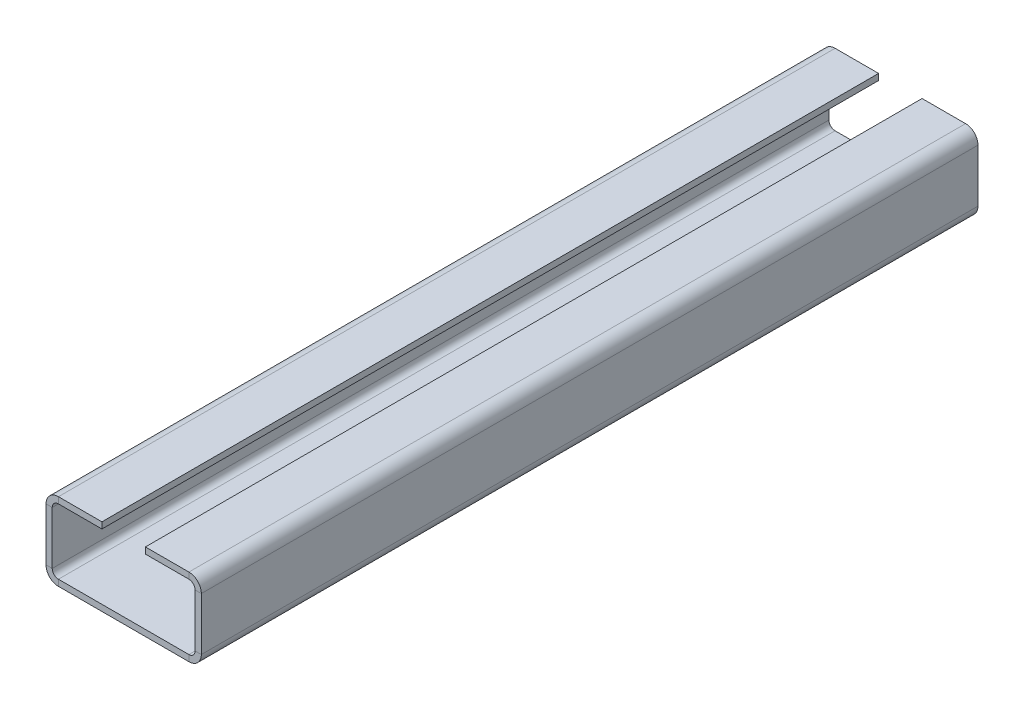
ISO-10303-21;
HEADER;
FILE_DESCRIPTION(('STEP AP214'),'2;1');
FILE_NAME('part.step','',(''),(''),'','','');
FILE_SCHEMA(('AUTOMOTIVE_DESIGN { 1 0 10303 214 1 1 1 1 }'));
ENDSEC;
DATA;
#1=APPLICATION_CONTEXT('core data for automotive mechanical design processes');
#2=APPLICATION_PROTOCOL_DEFINITION('international standard','automotive_design',2000,#1);
#3=PRODUCT_CONTEXT('',#1,'mechanical');
#4=PRODUCT('Part','Part','',(#3));
#5=PRODUCT_RELATED_PRODUCT_CATEGORY('part','',(#4));
#6=PRODUCT_DEFINITION_FORMATION('','',#4);
#7=PRODUCT_DEFINITION_CONTEXT('part definition',#1,'design');
#8=PRODUCT_DEFINITION('design','',#6,#7);
#9=PRODUCT_DEFINITION_SHAPE('','',#8);
#10=(LENGTH_UNIT() NAMED_UNIT(*) SI_UNIT(.MILLI.,.METRE.));
#11=(NAMED_UNIT(*) PLANE_ANGLE_UNIT() SI_UNIT($,.RADIAN.));
#12=(NAMED_UNIT(*) SI_UNIT($,.STERADIAN.) SOLID_ANGLE_UNIT());
#13=UNCERTAINTY_MEASURE_WITH_UNIT(LENGTH_MEASURE(1.E-05),#10,'distance_accuracy_value','');
#14=(GEOMETRIC_REPRESENTATION_CONTEXT(3) GLOBAL_UNCERTAINTY_ASSIGNED_CONTEXT((#13)) GLOBAL_UNIT_ASSIGNED_CONTEXT((#10,
#11,#12)) REPRESENTATION_CONTEXT('',''));
#15=CARTESIAN_POINT('',(0.,0.,0.));
#16=DIRECTION('',(0.,0.,1.));
#17=DIRECTION('',(1.,0.,0.));
#18=AXIS2_PLACEMENT_3D('',#15,#16,#17);
#19=CARTESIAN_POINT('',(4.,25.,250.));
#20=DIRECTION('',(0.,0.,1.));
#21=DIRECTION('',(1.,0.,0.));
#22=AXIS2_PLACEMENT_3D('',#19,#20,#21);
#23=PLANE('',#22);
#24=DIRECTION('',(0.,-1.,0.));
#25=VECTOR('',#24,1.);
#26=CARTESIAN_POINT('',(4.,25.,250.));
#27=LINE('',#26,#25);
#28=CARTESIAN_POINT('',(4.,25.,250.));
#29=VERTEX_POINT('',#28);
#30=CARTESIAN_POINT('',(4.,23.,250.));
#31=VERTEX_POINT('',#30);
#32=EDGE_CURVE('E11',#29,#31,#27,.T.);
#33=ORIENTED_EDGE('',*,*,#32,.F.);
#34=CARTESIAN_POINT('',(4.,21.,250.));
#35=DIRECTION('',(0.,0.,-1.));
#36=DIRECTION('',(-1.,0.,0.));
#37=AXIS2_PLACEMENT_3D('',#34,#35,#36);
#38=CIRCLE('',#37,4.);
#39=CARTESIAN_POINT('',(0.,21.,250.));
#40=VERTEX_POINT('',#39);
#41=EDGE_CURVE('E361',#29,#40,#38,.F.);
#42=ORIENTED_EDGE('',*,*,#41,.T.);
#43=DIRECTION('',(-1.,0.,0.));
#44=VECTOR('',#43,1.);
#45=CARTESIAN_POINT('',(2.,21.,250.));
#46=LINE('',#45,#44);
#47=CARTESIAN_POINT('',(2.,21.,250.));
#48=VERTEX_POINT('',#47);
#49=EDGE_CURVE('E44',#48,#40,#46,.T.);
#50=ORIENTED_EDGE('',*,*,#49,.F.);
#51=CARTESIAN_POINT('',(4.,21.,250.));
#52=DIRECTION('',(0.,0.,1.));
#53=DIRECTION('',(1.,0.,0.));
#54=AXIS2_PLACEMENT_3D('',#51,#52,#53);
#55=CIRCLE('',#54,2.);
#56=EDGE_CURVE('E436',#31,#48,#55,.T.);
#57=ORIENTED_EDGE('',*,*,#56,.F.);
#58=EDGE_LOOP('',(#33,#42,#50,#57));
#59=FACE_BOUND('',#58,.T.);
#60=ADVANCED_FACE('F36',(#59),#23,.T.);
#61=CARTESIAN_POINT('',(2.,21.,250.));
#62=DIRECTION('',(0.,0.,1.));
#63=DIRECTION('',(1.,0.,0.));
#64=AXIS2_PLACEMENT_3D('',#61,#62,#63);
#65=PLANE('',#64);
#66=DIRECTION('',(-1.,0.,0.));
#67=VECTOR('',#66,1.);
#68=CARTESIAN_POINT('',(18.,25.,250.));
#69=LINE('',#68,#67);
#70=CARTESIAN_POINT('',(18.,25.,250.));
#71=VERTEX_POINT('',#70);
#72=EDGE_CURVE('E365',#71,#29,#69,.T.);
#73=ORIENTED_EDGE('',*,*,#72,.T.);
#74=ORIENTED_EDGE('',*,*,#32,.T.);
#75=DIRECTION('',(1.,0.,0.));
#76=VECTOR('',#75,1.);
#77=CARTESIAN_POINT('',(18.,23.,250.));
#78=LINE('',#77,#76);
#79=CARTESIAN_POINT('',(18.,23.,250.));
#80=VERTEX_POINT('',#79);
#81=EDGE_CURVE('E438',#80,#31,#78,.F.);
#82=ORIENTED_EDGE('',*,*,#81,.F.);
#83=DIRECTION('',(0.,-1.,0.));
#84=VECTOR('',#83,1.);
#85=CARTESIAN_POINT('',(18.,25.,250.));
#86=LINE('',#85,#84);
#87=EDGE_CURVE('E441',#71,#80,#86,.T.);
#88=ORIENTED_EDGE('',*,*,#87,.F.);
#89=EDGE_LOOP('',(#73,#74,#82,#88));
#90=FACE_BOUND('',#89,.T.);
#91=ADVANCED_FACE('F447',(#90),#65,.T.);
#92=CARTESIAN_POINT('',(0.,21.,0.));
#93=DIRECTION('',(0.,0.,-1.));
#94=DIRECTION('',(-1.,0.,0.));
#95=AXIS2_PLACEMENT_3D('',#92,#93,#94);
#96=PLANE('',#95);
#97=DIRECTION('',(1.,0.,0.));
#98=VECTOR('',#97,1.);
#99=CARTESIAN_POINT('',(0.,21.,0.));
#100=LINE('',#99,#98);
#101=CARTESIAN_POINT('',(0.,21.,0.));
#102=VERTEX_POINT('',#101);
#103=CARTESIAN_POINT('',(2.,21.,0.));
#104=VERTEX_POINT('',#103);
#105=EDGE_CURVE('E345',#102,#104,#100,.T.);
#106=ORIENTED_EDGE('',*,*,#105,.F.);
#107=CARTESIAN_POINT('',(4.,21.,0.));
#108=DIRECTION('',(0.,0.,-1.));
#109=DIRECTION('',(-1.,0.,0.));
#110=AXIS2_PLACEMENT_3D('',#107,#108,#109);
#111=CIRCLE('',#110,4.);
#112=CARTESIAN_POINT('',(4.,25.,0.));
#113=VERTEX_POINT('',#112);
#114=EDGE_CURVE('E261',#113,#102,#111,.F.);
#115=ORIENTED_EDGE('',*,*,#114,.F.);
#116=DIRECTION('',(0.,1.,0.));
#117=VECTOR('',#116,1.);
#118=CARTESIAN_POINT('',(4.,23.,0.));
#119=LINE('',#118,#117);
#120=CARTESIAN_POINT('',(4.,23.,0.));
#121=VERTEX_POINT('',#120);
#122=EDGE_CURVE('E343',#121,#113,#119,.T.);
#123=ORIENTED_EDGE('',*,*,#122,.F.);
#124=CARTESIAN_POINT('',(4.,21.,0.));
#125=DIRECTION('',(0.,0.,1.));
#126=DIRECTION('',(1.,0.,0.));
#127=AXIS2_PLACEMENT_3D('',#124,#125,#126);
#128=CIRCLE('',#127,2.);
#129=EDGE_CURVE('E249',#121,#104,#128,.T.);
#130=ORIENTED_EDGE('',*,*,#129,.T.);
#131=EDGE_LOOP('',(#106,#115,#123,#130));
#132=FACE_BOUND('',#131,.T.);
#133=ADVANCED_FACE('F454',(#132),#96,.T.);
#134=CARTESIAN_POINT('',(4.,23.,0.));
#135=DIRECTION('',(0.,0.,-1.));
#136=DIRECTION('',(-1.,0.,0.));
#137=AXIS2_PLACEMENT_3D('',#134,#135,#136);
#138=PLANE('',#137);
#139=DIRECTION('',(0.,-1.,0.));
#140=VECTOR('',#139,1.);
#141=CARTESIAN_POINT('',(0.,25.,0.));
#142=LINE('',#141,#140);
#143=CARTESIAN_POINT('',(0.,4.,0.));
#144=VERTEX_POINT('',#143);
#145=EDGE_CURVE('E264',#102,#144,#142,.T.);
#146=ORIENTED_EDGE('',*,*,#145,.F.);
#147=ORIENTED_EDGE('',*,*,#105,.T.);
#148=DIRECTION('',(0.,-1.,0.));
#149=VECTOR('',#148,1.);
#150=CARTESIAN_POINT('',(2.,25.,0.));
#151=LINE('',#150,#149);
#152=CARTESIAN_POINT('',(2.,4.,0.));
#153=VERTEX_POINT('',#152);
#154=EDGE_CURVE('E246',#104,#153,#151,.T.);
#155=ORIENTED_EDGE('',*,*,#154,.T.);
#156=DIRECTION('',(-1.,0.,0.));
#157=VECTOR('',#156,1.);
#158=CARTESIAN_POINT('',(2.,4.,0.));
#159=LINE('',#158,#157);
#160=EDGE_CURVE('E335',#153,#144,#159,.T.);
#161=ORIENTED_EDGE('',*,*,#160,.T.);
#162=EDGE_LOOP('',(#146,#147,#155,#161));
#163=FACE_BOUND('',#162,.T.);
#164=ADVANCED_FACE('F457',(#163),#138,.T.);
#165=CARTESIAN_POINT('',(0.,4.,250.));
#166=DIRECTION('',(0.,0.,1.));
#167=DIRECTION('',(1.,0.,0.));
#168=AXIS2_PLACEMENT_3D('',#165,#166,#167);
#169=PLANE('',#168);
#170=DIRECTION('',(1.,0.,0.));
#171=VECTOR('',#170,1.);
#172=CARTESIAN_POINT('',(0.,4.,250.));
#173=LINE('',#172,#171);
#174=CARTESIAN_POINT('',(0.,4.,250.));
#175=VERTEX_POINT('',#174);
#176=CARTESIAN_POINT('',(2.,4.,250.));
#177=VERTEX_POINT('',#176);
#178=EDGE_CURVE('E341',#175,#177,#173,.T.);
#179=ORIENTED_EDGE('',*,*,#178,.F.);
#180=CARTESIAN_POINT('',(4.,4.,250.));
#181=DIRECTION('',(0.,0.,-1.));
#182=DIRECTION('',(-1.,0.,0.));
#183=AXIS2_PLACEMENT_3D('',#180,#181,#182);
#184=CIRCLE('',#183,4.);
#185=CARTESIAN_POINT('',(4.,0.,250.));
#186=VERTEX_POINT('',#185);
#187=EDGE_CURVE('E373',#175,#186,#184,.F.);
#188=ORIENTED_EDGE('',*,*,#187,.T.);
#189=DIRECTION('',(0.,-1.,0.));
#190=VECTOR('',#189,1.);
#191=CARTESIAN_POINT('',(4.,2.,250.));
#192=LINE('',#191,#190);
#193=CARTESIAN_POINT('',(4.,2.,250.));
#194=VERTEX_POINT('',#193);
#195=EDGE_CURVE('E339',#194,#186,#192,.T.);
#196=ORIENTED_EDGE('',*,*,#195,.F.);
#197=CARTESIAN_POINT('',(4.,4.,250.));
#198=DIRECTION('',(0.,0.,1.));
#199=DIRECTION('',(1.,0.,0.));
#200=AXIS2_PLACEMENT_3D('',#197,#198,#199);
#201=CIRCLE('',#200,2.);
#202=EDGE_CURVE('E432',#177,#194,#201,.T.);
#203=ORIENTED_EDGE('',*,*,#202,.F.);
#204=EDGE_LOOP('',(#179,#188,#196,#203));
#205=FACE_BOUND('',#204,.T.);
#206=ADVANCED_FACE('F477',(#205),#169,.T.);
#207=CARTESIAN_POINT('',(4.,2.,250.));
#208=DIRECTION('',(0.,0.,1.));
#209=DIRECTION('',(1.,0.,0.));
#210=AXIS2_PLACEMENT_3D('',#207,#208,#209);
#211=PLANE('',#210);
#212=DIRECTION('',(0.,-1.,0.));
#213=VECTOR('',#212,1.);
#214=CARTESIAN_POINT('',(0.,25.,250.));
#215=LINE('',#214,#213);
#216=EDGE_CURVE('E352',#40,#175,#215,.T.);
#217=ORIENTED_EDGE('',*,*,#216,.T.);
#218=ORIENTED_EDGE('',*,*,#178,.T.);
#219=DIRECTION('',(0.,-1.,0.));
#220=VECTOR('',#219,1.);
#221=CARTESIAN_POINT('',(2.,25.,250.));
#222=LINE('',#221,#220);
#223=EDGE_CURVE('E355',#48,#177,#222,.T.);
#224=ORIENTED_EDGE('',*,*,#223,.F.);
#225=ORIENTED_EDGE('',*,*,#49,.T.);
#226=EDGE_LOOP('',(#217,#218,#224,#225));
#227=FACE_BOUND('',#226,.T.);
#228=ADVANCED_FACE('F350',(#227),#211,.T.);
#229=CARTESIAN_POINT('',(4.,0.,0.));
#230=DIRECTION('',(0.,0.,-1.));
#231=DIRECTION('',(-1.,0.,0.));
#232=AXIS2_PLACEMENT_3D('',#229,#230,#231);
#233=PLANE('',#232);
#234=DIRECTION('',(0.,1.,0.));
#235=VECTOR('',#234,1.);
#236=CARTESIAN_POINT('',(4.,0.,0.));
#237=LINE('',#236,#235);
#238=CARTESIAN_POINT('',(4.,0.,0.));
#239=VERTEX_POINT('',#238);
#240=CARTESIAN_POINT('',(4.,2.,0.));
#241=VERTEX_POINT('',#240);
#242=EDGE_CURVE('E337',#239,#241,#237,.T.);
#243=ORIENTED_EDGE('',*,*,#242,.F.);
#244=CARTESIAN_POINT('',(4.,4.,0.));
#245=DIRECTION('',(0.,0.,-1.));
#246=DIRECTION('',(-1.,0.,0.));
#247=AXIS2_PLACEMENT_3D('',#244,#245,#246);
#248=CIRCLE('',#247,4.);
#249=EDGE_CURVE('E267',#144,#239,#248,.F.);
#250=ORIENTED_EDGE('',*,*,#249,.F.);
#251=ORIENTED_EDGE('',*,*,#160,.F.);
#252=CARTESIAN_POINT('',(4.,4.,0.));
#253=DIRECTION('',(0.,0.,1.));
#254=DIRECTION('',(1.,0.,0.));
#255=AXIS2_PLACEMENT_3D('',#252,#253,#254);
#256=CIRCLE('',#255,2.);
#257=EDGE_CURVE('E243',#153,#241,#256,.T.);
#258=ORIENTED_EDGE('',*,*,#257,.T.);
#259=EDGE_LOOP('',(#243,#250,#251,#258));
#260=FACE_BOUND('',#259,.T.);
#261=ADVANCED_FACE('F471',(#260),#233,.T.);
#262=CARTESIAN_POINT('',(2.,4.,0.));
#263=DIRECTION('',(0.,0.,-1.));
#264=DIRECTION('',(-1.,0.,0.));
#265=AXIS2_PLACEMENT_3D('',#262,#263,#264);
#266=PLANE('',#265);
#267=DIRECTION('',(1.,0.,0.));
#268=VECTOR('',#267,1.);
#269=CARTESIAN_POINT('',(0.,0.,0.));
#270=LINE('',#269,#268);
#271=CARTESIAN_POINT('',(46.,0.,0.));
#272=VERTEX_POINT('',#271);
#273=EDGE_CURVE('E270',#239,#272,#270,.T.);
#274=ORIENTED_EDGE('',*,*,#273,.F.);
#275=ORIENTED_EDGE('',*,*,#242,.T.);
#276=DIRECTION('',(1.,0.,0.));
#277=VECTOR('',#276,1.);
#278=CARTESIAN_POINT('',(0.,2.,0.));
#279=LINE('',#278,#277);
#280=CARTESIAN_POINT('',(46.,2.,0.));
#281=VERTEX_POINT('',#280);
#282=EDGE_CURVE('E240',#241,#281,#279,.T.);
#283=ORIENTED_EDGE('',*,*,#282,.T.);
#284=DIRECTION('',(0.,-1.,0.));
#285=VECTOR('',#284,1.);
#286=CARTESIAN_POINT('',(46.,2.,0.));
#287=LINE('',#286,#285);
#288=EDGE_CURVE('E331',#281,#272,#287,.T.);
#289=ORIENTED_EDGE('',*,*,#288,.T.);
#290=EDGE_LOOP('',(#274,#275,#283,#289));
#291=FACE_BOUND('',#290,.T.);
#292=ADVANCED_FACE('F481',(#291),#266,.T.);
#293=CARTESIAN_POINT('',(46.,0.,250.));
#294=DIRECTION('',(0.,0.,1.));
#295=DIRECTION('',(1.,0.,0.));
#296=AXIS2_PLACEMENT_3D('',#293,#294,#295);
#297=PLANE('',#296);
#298=DIRECTION('',(0.,1.,0.));
#299=VECTOR('',#298,1.);
#300=CARTESIAN_POINT('',(46.,0.,250.));
#301=LINE('',#300,#299);
#302=CARTESIAN_POINT('',(46.,0.,250.));
#303=VERTEX_POINT('',#302);
#304=CARTESIAN_POINT('',(46.,2.,250.));
#305=VERTEX_POINT('',#304);
#306=EDGE_CURVE('E193',#303,#305,#301,.T.);
#307=ORIENTED_EDGE('',*,*,#306,.F.);
#308=CARTESIAN_POINT('',(46.,4.,250.));
#309=DIRECTION('',(0.,0.,-1.));
#310=DIRECTION('',(-1.,0.,0.));
#311=AXIS2_PLACEMENT_3D('',#308,#309,#310);
#312=CIRCLE('',#311,4.);
#313=CARTESIAN_POINT('',(50.,4.,250.));
#314=VERTEX_POINT('',#313);
#315=EDGE_CURVE('E197',#303,#314,#312,.F.);
#316=ORIENTED_EDGE('',*,*,#315,.T.);
#317=DIRECTION('',(1.,0.,0.));
#318=VECTOR('',#317,1.);
#319=CARTESIAN_POINT('',(48.,4.,250.));
#320=LINE('',#319,#318);
#321=CARTESIAN_POINT('',(48.,4.,250.));
#322=VERTEX_POINT('',#321);
#323=EDGE_CURVE('E181',#322,#314,#320,.T.);
#324=ORIENTED_EDGE('',*,*,#323,.F.);
#325=CARTESIAN_POINT('',(46.,4.,250.));
#326=DIRECTION('',(0.,0.,1.));
#327=DIRECTION('',(1.,0.,0.));
#328=AXIS2_PLACEMENT_3D('',#325,#326,#327);
#329=CIRCLE('',#328,2.);
#330=EDGE_CURVE('E394',#305,#322,#329,.T.);
#331=ORIENTED_EDGE('',*,*,#330,.F.);
#332=EDGE_LOOP('',(#307,#316,#324,#331));
#333=FACE_BOUND('',#332,.T.);
#334=ADVANCED_FACE('F199',(#333),#297,.T.);
#335=CARTESIAN_POINT('',(48.,4.,250.));
#336=DIRECTION('',(0.,0.,1.));
#337=DIRECTION('',(1.,0.,0.));
#338=AXIS2_PLACEMENT_3D('',#335,#336,#337);
#339=PLANE('',#338);
#340=DIRECTION('',(1.,0.,0.));
#341=VECTOR('',#340,1.);
#342=CARTESIAN_POINT('',(0.,0.,250.));
#343=LINE('',#342,#341);
#344=EDGE_CURVE('E203',#186,#303,#343,.T.);
#345=ORIENTED_EDGE('',*,*,#344,.T.);
#346=ORIENTED_EDGE('',*,*,#306,.T.);
#347=DIRECTION('',(1.,0.,0.));
#348=VECTOR('',#347,1.);
#349=CARTESIAN_POINT('',(0.,2.,250.));
#350=LINE('',#349,#348);
#351=EDGE_CURVE('E429',#194,#305,#350,.T.);
#352=ORIENTED_EDGE('',*,*,#351,.F.);
#353=ORIENTED_EDGE('',*,*,#195,.T.);
#354=EDGE_LOOP('',(#345,#346,#352,#353));
#355=FACE_BOUND('',#354,.T.);
#356=ADVANCED_FACE('F381',(#355),#339,.T.);
#357=CARTESIAN_POINT('',(50.,4.,0.));
#358=DIRECTION('',(0.,0.,-1.));
#359=DIRECTION('',(-1.,0.,0.));
#360=AXIS2_PLACEMENT_3D('',#357,#358,#359);
#361=PLANE('',#360);
#362=DIRECTION('',(-1.,0.,0.));
#363=VECTOR('',#362,1.);
#364=CARTESIAN_POINT('',(50.,4.,0.));
#365=LINE('',#364,#363);
#366=CARTESIAN_POINT('',(50.,4.,0.));
#367=VERTEX_POINT('',#366);
#368=CARTESIAN_POINT('',(48.,4.,0.));
#369=VERTEX_POINT('',#368);
#370=EDGE_CURVE('E194',#367,#369,#365,.T.);
#371=ORIENTED_EDGE('',*,*,#370,.F.);
#372=CARTESIAN_POINT('',(46.,4.,0.));
#373=DIRECTION('',(0.,0.,-1.));
#374=DIRECTION('',(-1.,0.,0.));
#375=AXIS2_PLACEMENT_3D('',#372,#373,#374);
#376=CIRCLE('',#375,4.);
#377=EDGE_CURVE('E210',#272,#367,#376,.F.);
#378=ORIENTED_EDGE('',*,*,#377,.F.);
#379=ORIENTED_EDGE('',*,*,#288,.F.);
#380=CARTESIAN_POINT('',(46.,4.,0.));
#381=DIRECTION('',(0.,0.,1.));
#382=DIRECTION('',(1.,0.,0.));
#383=AXIS2_PLACEMENT_3D('',#380,#381,#382);
#384=CIRCLE('',#383,2.);
#385=EDGE_CURVE('E237',#281,#369,#384,.T.);
#386=ORIENTED_EDGE('',*,*,#385,.T.);
#387=EDGE_LOOP('',(#371,#378,#379,#386));
#388=FACE_BOUND('',#387,.T.);
#389=ADVANCED_FACE('F388',(#388),#361,.T.);
#390=CARTESIAN_POINT('',(46.,2.,0.));
#391=DIRECTION('',(0.,0.,-1.));
#392=DIRECTION('',(-1.,0.,0.));
#393=AXIS2_PLACEMENT_3D('',#390,#391,#392);
#394=PLANE('',#393);
#395=DIRECTION('',(0.,1.,0.));
#396=VECTOR('',#395,1.);
#397=CARTESIAN_POINT('',(50.,0.,0.));
#398=LINE('',#397,#396);
#399=CARTESIAN_POINT('',(50.,21.,0.));
#400=VERTEX_POINT('',#399);
#401=EDGE_CURVE('E274',#367,#400,#398,.T.);
#402=ORIENTED_EDGE('',*,*,#401,.F.);
#403=ORIENTED_EDGE('',*,*,#370,.T.);
#404=DIRECTION('',(0.,1.,0.));
#405=VECTOR('',#404,1.);
#406=CARTESIAN_POINT('',(48.,0.,0.));
#407=LINE('',#406,#405);
#408=CARTESIAN_POINT('',(48.,21.,0.));
#409=VERTEX_POINT('',#408);
#410=EDGE_CURVE('E235',#369,#409,#407,.T.);
#411=ORIENTED_EDGE('',*,*,#410,.T.);
#412=DIRECTION('',(1.,0.,0.));
#413=VECTOR('',#412,1.);
#414=CARTESIAN_POINT('',(48.,21.,0.));
#415=LINE('',#414,#413);
#416=EDGE_CURVE('E117',#409,#400,#415,.T.);
#417=ORIENTED_EDGE('',*,*,#416,.T.);
#418=EDGE_LOOP('',(#402,#403,#411,#417));
#419=FACE_BOUND('',#418,.T.);
#420=ADVANCED_FACE('F390',(#419),#394,.T.);
#421=CARTESIAN_POINT('',(50.,21.,250.));
#422=DIRECTION('',(0.,0.,1.));
#423=DIRECTION('',(1.,0.,0.));
#424=AXIS2_PLACEMENT_3D('',#421,#422,#423);
#425=PLANE('',#424);
#426=DIRECTION('',(-1.,0.,0.));
#427=VECTOR('',#426,1.);
#428=CARTESIAN_POINT('',(50.,21.,250.));
#429=LINE('',#428,#427);
#430=CARTESIAN_POINT('',(50.,21.,250.));
#431=VERTEX_POINT('',#430);
#432=CARTESIAN_POINT('',(48.,21.,250.));
#433=VERTEX_POINT('',#432);
#434=EDGE_CURVE('E329',#431,#433,#429,.T.);
#435=ORIENTED_EDGE('',*,*,#434,.F.);
#436=CARTESIAN_POINT('',(46.,21.,250.));
#437=DIRECTION('',(0.,0.,-1.));
#438=DIRECTION('',(-1.,0.,0.));
#439=AXIS2_PLACEMENT_3D('',#436,#437,#438);
#440=CIRCLE('',#439,4.);
#441=CARTESIAN_POINT('',(46.,25.,250.));
#442=VERTEX_POINT('',#441);
#443=EDGE_CURVE('E218',#431,#442,#440,.F.);
#444=ORIENTED_EDGE('',*,*,#443,.T.);
#445=DIRECTION('',(0.,1.,0.));
#446=VECTOR('',#445,1.);
#447=CARTESIAN_POINT('',(46.,23.,250.));
#448=LINE('',#447,#446);
#449=CARTESIAN_POINT('',(46.,23.,250.));
#450=VERTEX_POINT('',#449);
#451=EDGE_CURVE('E52',#450,#442,#448,.T.);
#452=ORIENTED_EDGE('',*,*,#451,.F.);
#453=CARTESIAN_POINT('',(46.,21.,250.));
#454=DIRECTION('',(0.,0.,1.));
#455=DIRECTION('',(1.,0.,0.));
#456=AXIS2_PLACEMENT_3D('',#453,#454,#455);
#457=CIRCLE('',#456,2.);
#458=EDGE_CURVE('E422',#433,#450,#457,.T.);
#459=ORIENTED_EDGE('',*,*,#458,.F.);
#460=EDGE_LOOP('',(#435,#444,#452,#459));
#461=FACE_BOUND('',#460,.T.);
#462=ADVANCED_FACE('F552',(#461),#425,.T.);
#463=CARTESIAN_POINT('',(46.,23.,250.));
#464=DIRECTION('',(0.,0.,1.));
#465=DIRECTION('',(1.,0.,0.));
#466=AXIS2_PLACEMENT_3D('',#463,#464,#465);
#467=PLANE('',#466);
#468=DIRECTION('',(0.,1.,0.));
#469=VECTOR('',#468,1.);
#470=CARTESIAN_POINT('',(50.,0.,250.));
#471=LINE('',#470,#469);
#472=EDGE_CURVE('E185',#314,#431,#471,.T.);
#473=ORIENTED_EDGE('',*,*,#472,.T.);
#474=ORIENTED_EDGE('',*,*,#434,.T.);
#475=DIRECTION('',(0.,1.,0.));
#476=VECTOR('',#475,1.);
#477=CARTESIAN_POINT('',(48.,0.,250.));
#478=LINE('',#477,#476);
#479=EDGE_CURVE('E188',#322,#433,#478,.T.);
#480=ORIENTED_EDGE('',*,*,#479,.F.);
#481=ORIENTED_EDGE('',*,*,#323,.T.);
#482=EDGE_LOOP('',(#473,#474,#480,#481));
#483=FACE_BOUND('',#482,.T.);
#484=ADVANCED_FACE('F183',(#483),#467,.T.);
#485=CARTESIAN_POINT('',(46.,25.,0.));
#486=DIRECTION('',(0.,0.,-1.));
#487=DIRECTION('',(-1.,0.,0.));
#488=AXIS2_PLACEMENT_3D('',#485,#486,#487);
#489=PLANE('',#488);
#490=DIRECTION('',(0.,-1.,0.));
#491=VECTOR('',#490,1.);
#492=CARTESIAN_POINT('',(46.,25.,0.));
#493=LINE('',#492,#491);
#494=CARTESIAN_POINT('',(46.,25.,0.));
#495=VERTEX_POINT('',#494);
#496=CARTESIAN_POINT('',(46.,23.,0.));
#497=VERTEX_POINT('',#496);
#498=EDGE_CURVE('E124',#495,#497,#493,.T.);
#499=ORIENTED_EDGE('',*,*,#498,.F.);
#500=CARTESIAN_POINT('',(46.,21.,0.));
#501=DIRECTION('',(0.,0.,-1.));
#502=DIRECTION('',(-1.,0.,0.));
#503=AXIS2_PLACEMENT_3D('',#500,#501,#502);
#504=CIRCLE('',#503,4.);
#505=EDGE_CURVE('E276',#400,#495,#504,.F.);
#506=ORIENTED_EDGE('',*,*,#505,.F.);
#507=ORIENTED_EDGE('',*,*,#416,.F.);
#508=CARTESIAN_POINT('',(46.,21.,0.));
#509=DIRECTION('',(0.,0.,1.));
#510=DIRECTION('',(1.,0.,0.));
#511=AXIS2_PLACEMENT_3D('',#508,#509,#510);
#512=CIRCLE('',#511,2.);
#513=EDGE_CURVE('E233',#409,#497,#512,.T.);
#514=ORIENTED_EDGE('',*,*,#513,.T.);
#515=EDGE_LOOP('',(#499,#506,#507,#514));
#516=FACE_BOUND('',#515,.T.);
#517=ADVANCED_FACE('F405',(#516),#489,.T.);
#518=CARTESIAN_POINT('',(48.,21.,0.));
#519=DIRECTION('',(0.,0.,-1.));
#520=DIRECTION('',(-1.,0.,0.));
#521=AXIS2_PLACEMENT_3D('',#518,#519,#520);
#522=PLANE('',#521);
#523=DIRECTION('',(-1.,0.,0.));
#524=VECTOR('',#523,1.);
#525=CARTESIAN_POINT('',(50.,25.,0.));
#526=LINE('',#525,#524);
#527=CARTESIAN_POINT('',(32.,25.,0.));
#528=VERTEX_POINT('',#527);
#529=EDGE_CURVE('E224',#495,#528,#526,.T.);
#530=ORIENTED_EDGE('',*,*,#529,.F.);
#531=ORIENTED_EDGE('',*,*,#498,.T.);
#532=DIRECTION('',(-1.,0.,0.));
#533=VECTOR('',#532,1.);
#534=CARTESIAN_POINT('',(50.,23.,0.));
#535=LINE('',#534,#533);
#536=CARTESIAN_POINT('',(32.,23.,0.));
#537=VERTEX_POINT('',#536);
#538=EDGE_CURVE('E230',#497,#537,#535,.T.);
#539=ORIENTED_EDGE('',*,*,#538,.T.);
#540=DIRECTION('',(0.,1.,0.));
#541=VECTOR('',#540,1.);
#542=CARTESIAN_POINT('',(32.,23.,0.));
#543=LINE('',#542,#541);
#544=EDGE_CURVE('E227',#537,#528,#543,.T.);
#545=ORIENTED_EDGE('',*,*,#544,.T.);
#546=EDGE_LOOP('',(#530,#531,#539,#545));
#547=FACE_BOUND('',#546,.T.);
#548=ADVANCED_FACE('F413',(#547),#522,.T.);
#549=CARTESIAN_POINT('',(50.,25.,250.));
#550=DIRECTION('',(0.,-1.,0.));
#551=DIRECTION('',(1.,0.,0.));
#552=AXIS2_PLACEMENT_3D('',#549,#550,#551);
#553=PLANE('',#552);
#554=ORIENTED_EDGE('',*,*,#529,.T.);
#555=DIRECTION('',(0.,0.,-1.));
#556=VECTOR('',#555,1.);
#557=CARTESIAN_POINT('',(32.,25.,250.));
#558=LINE('',#557,#556);
#559=CARTESIAN_POINT('',(32.,25.,250.));
#560=VERTEX_POINT('',#559);
#561=EDGE_CURVE('E324',#560,#528,#558,.T.);
#562=ORIENTED_EDGE('',*,*,#561,.F.);
#563=DIRECTION('',(-1.,0.,0.));
#564=VECTOR('',#563,1.);
#565=CARTESIAN_POINT('',(50.,25.,250.));
#566=LINE('',#565,#564);
#567=EDGE_CURVE('E130',#442,#560,#566,.T.);
#568=ORIENTED_EDGE('',*,*,#567,.F.);
#569=DIRECTION('',(0.,0.,-1.));
#570=VECTOR('',#569,1.);
#571=CARTESIAN_POINT('',(46.,25.,250.));
#572=LINE('',#571,#570);
#573=EDGE_CURVE('E220',#442,#495,#572,.T.);
#574=ORIENTED_EDGE('',*,*,#573,.T.);
#575=EDGE_LOOP('',(#554,#562,#568,#574));
#576=FACE_BOUND('',#575,.T.);
#577=ADVANCED_FACE('F411',(#576),#553,.F.);
#578=CARTESIAN_POINT('',(32.,23.,250.));
#579=DIRECTION('',(-1.,0.,0.));
#580=DIRECTION('',(0.,0.,1.));
#581=AXIS2_PLACEMENT_3D('',#578,#579,#580);
#582=PLANE('',#581);
#583=ORIENTED_EDGE('',*,*,#544,.F.);
#584=DIRECTION('',(0.,0.,-1.));
#585=VECTOR('',#584,1.);
#586=CARTESIAN_POINT('',(32.,23.,250.));
#587=LINE('',#586,#585);
#588=CARTESIAN_POINT('',(32.,23.,250.));
#589=VERTEX_POINT('',#588);
#590=EDGE_CURVE('E322',#589,#537,#587,.T.);
#591=ORIENTED_EDGE('',*,*,#590,.F.);
#592=DIRECTION('',(0.,1.,0.));
#593=VECTOR('',#592,1.);
#594=CARTESIAN_POINT('',(32.,23.,250.));
#595=LINE('',#594,#593);
#596=EDGE_CURVE('E418',#589,#560,#595,.T.);
#597=ORIENTED_EDGE('',*,*,#596,.T.);
#598=ORIENTED_EDGE('',*,*,#561,.T.);
#599=EDGE_LOOP('',(#583,#591,#597,#598));
#600=FACE_BOUND('',#599,.T.);
#601=ADVANCED_FACE('F416',(#600),#582,.T.);
#602=CARTESIAN_POINT('',(50.,23.,250.));
#603=DIRECTION('',(0.,-1.,0.));
#604=DIRECTION('',(1.,0.,0.));
#605=AXIS2_PLACEMENT_3D('',#602,#603,#604);
#606=PLANE('',#605);
#607=ORIENTED_EDGE('',*,*,#538,.F.);
#608=DIRECTION('',(0.,0.,-1.));
#609=VECTOR('',#608,1.);
#610=CARTESIAN_POINT('',(46.,23.,250.));
#611=LINE('',#610,#609);
#612=EDGE_CURVE('E319',#450,#497,#611,.T.);
#613=ORIENTED_EDGE('',*,*,#612,.F.);
#614=DIRECTION('',(-1.,0.,0.));
#615=VECTOR('',#614,1.);
#616=CARTESIAN_POINT('',(50.,23.,250.));
#617=LINE('',#616,#615);
#618=EDGE_CURVE('E420',#450,#589,#617,.T.);
#619=ORIENTED_EDGE('',*,*,#618,.T.);
#620=ORIENTED_EDGE('',*,*,#590,.T.);
#621=EDGE_LOOP('',(#607,#613,#619,#620));
#622=FACE_BOUND('',#621,.T.);
#623=ADVANCED_FACE('F608',(#622),#606,.T.);
#624=CARTESIAN_POINT('',(46.,21.,250.));
#625=DIRECTION('',(0.,0.,-1.));
#626=DIRECTION('',(-1.,0.,0.));
#627=AXIS2_PLACEMENT_3D('',#624,#625,#626);
#628=CYLINDRICAL_SURFACE('',#627,2.);
#629=ORIENTED_EDGE('',*,*,#513,.F.);
#630=DIRECTION('',(0.,0.,-1.));
#631=VECTOR('',#630,1.);
#632=CARTESIAN_POINT('',(48.,21.,250.));
#633=LINE('',#632,#631);
#634=EDGE_CURVE('E316',#433,#409,#633,.T.);
#635=ORIENTED_EDGE('',*,*,#634,.F.);
#636=ORIENTED_EDGE('',*,*,#458,.T.);
#637=ORIENTED_EDGE('',*,*,#612,.T.);
#638=EDGE_LOOP('',(#629,#635,#636,#637));
#639=FACE_BOUND('',#638,.T.);
#640=ADVANCED_FACE('F402',(#639),#628,.F.);
#641=CARTESIAN_POINT('',(48.,0.,250.));
#642=DIRECTION('',(-1.,0.,0.));
#643=DIRECTION('',(0.,0.,1.));
#644=AXIS2_PLACEMENT_3D('',#641,#642,#643);
#645=PLANE('',#644);
#646=ORIENTED_EDGE('',*,*,#410,.F.);
#647=DIRECTION('',(0.,0.,-1.));
#648=VECTOR('',#647,1.);
#649=CARTESIAN_POINT('',(48.,4.,250.));
#650=LINE('',#649,#648);
#651=EDGE_CURVE('E313',#322,#369,#650,.T.);
#652=ORIENTED_EDGE('',*,*,#651,.F.);
#653=ORIENTED_EDGE('',*,*,#479,.T.);
#654=ORIENTED_EDGE('',*,*,#634,.T.);
#655=EDGE_LOOP('',(#646,#652,#653,#654));
#656=FACE_BOUND('',#655,.T.);
#657=ADVANCED_FACE('F396',(#656),#645,.T.);
#658=CARTESIAN_POINT('',(46.,4.,250.));
#659=DIRECTION('',(0.,0.,-1.));
#660=DIRECTION('',(-1.,0.,0.));
#661=AXIS2_PLACEMENT_3D('',#658,#659,#660);
#662=CYLINDRICAL_SURFACE('',#661,2.);
#663=ORIENTED_EDGE('',*,*,#385,.F.);
#664=DIRECTION('',(0.,0.,-1.));
#665=VECTOR('',#664,1.);
#666=CARTESIAN_POINT('',(46.,2.,250.));
#667=LINE('',#666,#665);
#668=EDGE_CURVE('E310',#305,#281,#667,.T.);
#669=ORIENTED_EDGE('',*,*,#668,.F.);
#670=ORIENTED_EDGE('',*,*,#330,.T.);
#671=ORIENTED_EDGE('',*,*,#651,.T.);
#672=EDGE_LOOP('',(#663,#669,#670,#671));
#673=FACE_BOUND('',#672,.T.);
#674=ADVANCED_FACE('F393',(#673),#662,.F.);
#675=CARTESIAN_POINT('',(0.,2.,250.));
#676=DIRECTION('',(0.,1.,0.));
#677=DIRECTION('',(0.,0.,1.));
#678=AXIS2_PLACEMENT_3D('',#675,#676,#677);
#679=PLANE('',#678);
#680=ORIENTED_EDGE('',*,*,#282,.F.);
#681=DIRECTION('',(0.,0.,-1.));
#682=VECTOR('',#681,1.);
#683=CARTESIAN_POINT('',(4.,2.,250.));
#684=LINE('',#683,#682);
#685=EDGE_CURVE('E307',#194,#241,#684,.T.);
#686=ORIENTED_EDGE('',*,*,#685,.F.);
#687=ORIENTED_EDGE('',*,*,#351,.T.);
#688=ORIENTED_EDGE('',*,*,#668,.T.);
#689=EDGE_LOOP('',(#680,#686,#687,#688));
#690=FACE_BOUND('',#689,.T.);
#691=ADVANCED_FACE('F479',(#690),#679,.T.);
#692=CARTESIAN_POINT('',(4.,4.,250.));
#693=DIRECTION('',(0.,0.,-1.));
#694=DIRECTION('',(-1.,0.,0.));
#695=AXIS2_PLACEMENT_3D('',#692,#693,#694);
#696=CYLINDRICAL_SURFACE('',#695,2.);
#697=ORIENTED_EDGE('',*,*,#257,.F.);
#698=DIRECTION('',(0.,0.,-1.));
#699=VECTOR('',#698,1.);
#700=CARTESIAN_POINT('',(2.,4.,250.));
#701=LINE('',#700,#699);
#702=EDGE_CURVE('E304',#177,#153,#701,.T.);
#703=ORIENTED_EDGE('',*,*,#702,.F.);
#704=ORIENTED_EDGE('',*,*,#202,.T.);
#705=ORIENTED_EDGE('',*,*,#685,.T.);
#706=EDGE_LOOP('',(#697,#703,#704,#705));
#707=FACE_BOUND('',#706,.T.);
#708=ADVANCED_FACE('F467',(#707),#696,.F.);
#709=CARTESIAN_POINT('',(2.,25.,250.));
#710=DIRECTION('',(1.,0.,0.));
#711=DIRECTION('',(0.,1.,0.));
#712=AXIS2_PLACEMENT_3D('',#709,#710,#711);
#713=PLANE('',#712);
#714=ORIENTED_EDGE('',*,*,#154,.F.);
#715=DIRECTION('',(0.,0.,-1.));
#716=VECTOR('',#715,1.);
#717=CARTESIAN_POINT('',(2.,21.,250.));
#718=LINE('',#717,#716);
#719=EDGE_CURVE('E301',#48,#104,#718,.T.);
#720=ORIENTED_EDGE('',*,*,#719,.F.);
#721=ORIENTED_EDGE('',*,*,#223,.T.);
#722=ORIENTED_EDGE('',*,*,#702,.T.);
#723=EDGE_LOOP('',(#714,#720,#721,#722));
#724=FACE_BOUND('',#723,.T.);
#725=ADVANCED_FACE('F462',(#724),#713,.T.);
#726=CARTESIAN_POINT('',(4.,21.,250.));
#727=DIRECTION('',(0.,0.,-1.));
#728=DIRECTION('',(-1.,0.,0.));
#729=AXIS2_PLACEMENT_3D('',#726,#727,#728);
#730=CYLINDRICAL_SURFACE('',#729,2.);
#731=ORIENTED_EDGE('',*,*,#129,.F.);
#732=DIRECTION('',(0.,0.,-1.));
#733=VECTOR('',#732,1.);
#734=CARTESIAN_POINT('',(4.,23.,250.));
#735=LINE('',#734,#733);
#736=EDGE_CURVE('E298',#31,#121,#735,.T.);
#737=ORIENTED_EDGE('',*,*,#736,.F.);
#738=ORIENTED_EDGE('',*,*,#56,.T.);
#739=ORIENTED_EDGE('',*,*,#719,.T.);
#740=EDGE_LOOP('',(#731,#737,#738,#739));
#741=FACE_BOUND('',#740,.T.);
#742=ADVANCED_FACE('F460',(#741),#730,.F.);
#743=CARTESIAN_POINT('',(18.,23.,250.));
#744=DIRECTION('',(0.,-1.,0.));
#745=DIRECTION('',(0.,0.,-1.));
#746=AXIS2_PLACEMENT_3D('',#743,#744,#745);
#747=PLANE('',#746);
#748=DIRECTION('',(1.,0.,0.));
#749=VECTOR('',#748,1.);
#750=CARTESIAN_POINT('',(18.,23.,0.));
#751=LINE('',#750,#749);
#752=CARTESIAN_POINT('',(18.,23.,0.));
#753=VERTEX_POINT('',#752);
#754=EDGE_CURVE('E252',#753,#121,#751,.F.);
#755=ORIENTED_EDGE('',*,*,#754,.F.);
#756=DIRECTION('',(0.,0.,-1.));
#757=VECTOR('',#756,1.);
#758=CARTESIAN_POINT('',(18.,23.,250.));
#759=LINE('',#758,#757);
#760=EDGE_CURVE('E296',#80,#753,#759,.T.);
#761=ORIENTED_EDGE('',*,*,#760,.F.);
#762=ORIENTED_EDGE('',*,*,#81,.T.);
#763=ORIENTED_EDGE('',*,*,#736,.T.);
#764=EDGE_LOOP('',(#755,#761,#762,#763));
#765=FACE_BOUND('',#764,.T.);
#766=ADVANCED_FACE('F682',(#765),#747,.T.);
#767=CARTESIAN_POINT('',(18.,25.,250.));
#768=DIRECTION('',(1.,0.,0.));
#769=DIRECTION('',(0.,0.,-1.));
#770=AXIS2_PLACEMENT_3D('',#767,#768,#769);
#771=PLANE('',#770);
#772=DIRECTION('',(0.,-1.,0.));
#773=VECTOR('',#772,1.);
#774=CARTESIAN_POINT('',(18.,25.,0.));
#775=LINE('',#774,#773);
#776=CARTESIAN_POINT('',(18.,25.,0.));
#777=VERTEX_POINT('',#776);
#778=EDGE_CURVE('E255',#777,#753,#775,.T.);
#779=ORIENTED_EDGE('',*,*,#778,.F.);
#780=DIRECTION('',(0.,0.,-1.));
#781=VECTOR('',#780,1.);
#782=CARTESIAN_POINT('',(18.,25.,250.));
#783=LINE('',#782,#781);
#784=EDGE_CURVE('E294',#71,#777,#783,.T.);
#785=ORIENTED_EDGE('',*,*,#784,.F.);
#786=ORIENTED_EDGE('',*,*,#87,.T.);
#787=ORIENTED_EDGE('',*,*,#760,.T.);
#788=EDGE_LOOP('',(#779,#785,#786,#787));
#789=FACE_BOUND('',#788,.T.);
#790=ADVANCED_FACE('F692',(#789),#771,.T.);
#791=CARTESIAN_POINT('',(18.,25.,250.));
#792=DIRECTION('',(0.,-1.,0.));
#793=DIRECTION('',(0.,0.,-1.));
#794=AXIS2_PLACEMENT_3D('',#791,#792,#793);
#795=PLANE('',#794);
#796=DIRECTION('',(-1.,0.,0.));
#797=VECTOR('',#796,1.);
#798=CARTESIAN_POINT('',(18.,25.,0.));
#799=LINE('',#798,#797);
#800=EDGE_CURVE('E258',#777,#113,#799,.T.);
#801=ORIENTED_EDGE('',*,*,#800,.T.);
#802=DIRECTION('',(0.,0.,-1.));
#803=VECTOR('',#802,1.);
#804=CARTESIAN_POINT('',(4.,25.,250.));
#805=LINE('',#804,#803);
#806=EDGE_CURVE('E291',#29,#113,#805,.T.);
#807=ORIENTED_EDGE('',*,*,#806,.F.);
#808=ORIENTED_EDGE('',*,*,#72,.F.);
#809=ORIENTED_EDGE('',*,*,#784,.T.);
#810=EDGE_LOOP('',(#801,#807,#808,#809));
#811=FACE_BOUND('',#810,.T.);
#812=ADVANCED_FACE('F451',(#811),#795,.F.);
#813=CARTESIAN_POINT('',(4.,21.,250.));
#814=DIRECTION('',(0.,0.,-1.));
#815=DIRECTION('',(-1.,0.,0.));
#816=AXIS2_PLACEMENT_3D('',#813,#814,#815);
#817=CYLINDRICAL_SURFACE('',#816,4.);
#818=ORIENTED_EDGE('',*,*,#114,.T.);
#819=DIRECTION('',(0.,0.,-1.));
#820=VECTOR('',#819,1.);
#821=CARTESIAN_POINT('',(0.,21.,250.));
#822=LINE('',#821,#820);
#823=EDGE_CURVE('E288',#40,#102,#822,.T.);
#824=ORIENTED_EDGE('',*,*,#823,.F.);
#825=ORIENTED_EDGE('',*,*,#41,.F.);
#826=ORIENTED_EDGE('',*,*,#806,.T.);
#827=EDGE_LOOP('',(#818,#824,#825,#826));
#828=FACE_BOUND('',#827,.T.);
#829=ADVANCED_FACE('F367',(#828),#817,.T.);
#830=CARTESIAN_POINT('',(0.,25.,250.));
#831=DIRECTION('',(1.,0.,0.));
#832=DIRECTION('',(0.,1.,0.));
#833=AXIS2_PLACEMENT_3D('',#830,#831,#832);
#834=PLANE('',#833);
#835=ORIENTED_EDGE('',*,*,#145,.T.);
#836=DIRECTION('',(0.,0.,-1.));
#837=VECTOR('',#836,1.);
#838=CARTESIAN_POINT('',(0.,4.,250.));
#839=LINE('',#838,#837);
#840=EDGE_CURVE('E285',#175,#144,#839,.T.);
#841=ORIENTED_EDGE('',*,*,#840,.F.);
#842=ORIENTED_EDGE('',*,*,#216,.F.);
#843=ORIENTED_EDGE('',*,*,#823,.T.);
#844=EDGE_LOOP('',(#835,#841,#842,#843));
#845=FACE_BOUND('',#844,.T.);
#846=ADVANCED_FACE('F371',(#845),#834,.F.);
#847=CARTESIAN_POINT('',(4.,4.,250.));
#848=DIRECTION('',(0.,0.,-1.));
#849=DIRECTION('',(-1.,0.,0.));
#850=AXIS2_PLACEMENT_3D('',#847,#848,#849);
#851=CYLINDRICAL_SURFACE('',#850,4.);
#852=ORIENTED_EDGE('',*,*,#249,.T.);
#853=DIRECTION('',(0.,0.,-1.));
#854=VECTOR('',#853,1.);
#855=CARTESIAN_POINT('',(4.,0.,250.));
#856=LINE('',#855,#854);
#857=EDGE_CURVE('E282',#186,#239,#856,.T.);
#858=ORIENTED_EDGE('',*,*,#857,.F.);
#859=ORIENTED_EDGE('',*,*,#187,.F.);
#860=ORIENTED_EDGE('',*,*,#840,.T.);
#861=EDGE_LOOP('',(#852,#858,#859,#860));
#862=FACE_BOUND('',#861,.T.);
#863=ADVANCED_FACE('F474',(#862),#851,.T.);
#864=CARTESIAN_POINT('',(0.,0.,250.));
#865=DIRECTION('',(0.,1.,0.));
#866=DIRECTION('',(0.,0.,1.));
#867=AXIS2_PLACEMENT_3D('',#864,#865,#866);
#868=PLANE('',#867);
#869=ORIENTED_EDGE('',*,*,#273,.T.);
#870=DIRECTION('',(0.,0.,-1.));
#871=VECTOR('',#870,1.);
#872=CARTESIAN_POINT('',(46.,0.,250.));
#873=LINE('',#872,#871);
#874=EDGE_CURVE('E212',#303,#272,#873,.T.);
#875=ORIENTED_EDGE('',*,*,#874,.F.);
#876=ORIENTED_EDGE('',*,*,#344,.F.);
#877=ORIENTED_EDGE('',*,*,#857,.T.);
#878=EDGE_LOOP('',(#869,#875,#876,#877));
#879=FACE_BOUND('',#878,.T.);
#880=ADVANCED_FACE('F385',(#879),#868,.F.);
#881=CARTESIAN_POINT('',(46.,4.,250.));
#882=DIRECTION('',(0.,0.,-1.));
#883=DIRECTION('',(-1.,0.,0.));
#884=AXIS2_PLACEMENT_3D('',#881,#882,#883);
#885=CYLINDRICAL_SURFACE('',#884,4.);
#886=ORIENTED_EDGE('',*,*,#377,.T.);
#887=DIRECTION('',(0.,0.,-1.));
#888=VECTOR('',#887,1.);
#889=CARTESIAN_POINT('',(50.,4.,250.));
#890=LINE('',#889,#888);
#891=EDGE_CURVE('E207',#314,#367,#890,.T.);
#892=ORIENTED_EDGE('',*,*,#891,.F.);
#893=ORIENTED_EDGE('',*,*,#315,.F.);
#894=ORIENTED_EDGE('',*,*,#874,.T.);
#895=EDGE_LOOP('',(#886,#892,#893,#894));
#896=FACE_BOUND('',#895,.T.);
#897=ADVANCED_FACE('F208',(#896),#885,.T.);
#898=CARTESIAN_POINT('',(50.,0.,250.));
#899=DIRECTION('',(-1.,0.,0.));
#900=DIRECTION('',(0.,0.,1.));
#901=AXIS2_PLACEMENT_3D('',#898,#899,#900);
#902=PLANE('',#901);
#903=ORIENTED_EDGE('',*,*,#401,.T.);
#904=DIRECTION('',(0.,0.,-1.));
#905=VECTOR('',#904,1.);
#906=CARTESIAN_POINT('',(50.,21.,250.));
#907=LINE('',#906,#905);
#908=EDGE_CURVE('E213',#431,#400,#907,.T.);
#909=ORIENTED_EDGE('',*,*,#908,.F.);
#910=ORIENTED_EDGE('',*,*,#472,.F.);
#911=ORIENTED_EDGE('',*,*,#891,.T.);
#912=EDGE_LOOP('',(#903,#909,#910,#911));
#913=FACE_BOUND('',#912,.T.);
#914=ADVANCED_FACE('F215',(#913),#902,.F.);
#915=CARTESIAN_POINT('',(46.,21.,250.));
#916=DIRECTION('',(0.,0.,-1.));
#917=DIRECTION('',(-1.,0.,0.));
#918=AXIS2_PLACEMENT_3D('',#915,#916,#917);
#919=CYLINDRICAL_SURFACE('',#918,4.);
#920=ORIENTED_EDGE('',*,*,#505,.T.);
#921=ORIENTED_EDGE('',*,*,#573,.F.);
#922=ORIENTED_EDGE('',*,*,#443,.F.);
#923=ORIENTED_EDGE('',*,*,#908,.T.);
#924=EDGE_LOOP('',(#920,#921,#922,#923));
#925=FACE_BOUND('',#924,.T.);
#926=ADVANCED_FACE('F408',(#925),#919,.T.);
#927=CARTESIAN_POINT('',(46.,21.,250.));
#928=DIRECTION('',(0.,0.,1.));
#929=DIRECTION('',(1.,0.,0.));
#930=AXIS2_PLACEMENT_3D('',#927,#928,#929);
#931=PLANE('',#930);
#932=ORIENTED_EDGE('',*,*,#567,.T.);
#933=ORIENTED_EDGE('',*,*,#596,.F.);
#934=ORIENTED_EDGE('',*,*,#618,.F.);
#935=ORIENTED_EDGE('',*,*,#451,.T.);
#936=EDGE_LOOP('',(#932,#933,#934,#935));
#937=FACE_BOUND('',#936,.T.);
#938=ADVANCED_FACE('F776',(#937),#931,.T.);
#939=CARTESIAN_POINT('',(46.,21.,0.));
#940=DIRECTION('',(0.,0.,1.));
#941=DIRECTION('',(1.,0.,0.));
#942=AXIS2_PLACEMENT_3D('',#939,#940,#941);
#943=PLANE('',#942);
#944=ORIENTED_EDGE('',*,*,#754,.T.);
#945=ORIENTED_EDGE('',*,*,#122,.T.);
#946=ORIENTED_EDGE('',*,*,#800,.F.);
#947=ORIENTED_EDGE('',*,*,#778,.T.);
#948=EDGE_LOOP('',(#944,#945,#946,#947));
#949=FACE_BOUND('',#948,.T.);
#950=ADVANCED_FACE('F786',(#949),#943,.F.);
#951=CLOSED_SHELL('',(#60,#91,#133,#164,#206,#228,#261,#292,#334,#356,#389,#420,#462,#484,#517,
#548,#577,#601,#623,#640,#657,#674,#691,#708,#725,#742,#766,#790,#812,#829,#846,#863,#880,#897,
#914,#926,#938,#950));
#952=MANIFOLD_SOLID_BREP('B2',#951);
#953=ADVANCED_BREP_SHAPE_REPRESENTATION('',(#18,#952),#14);
#954=SHAPE_DEFINITION_REPRESENTATION(#9,#953);
ENDSEC;
END-ISO-10303-21;
